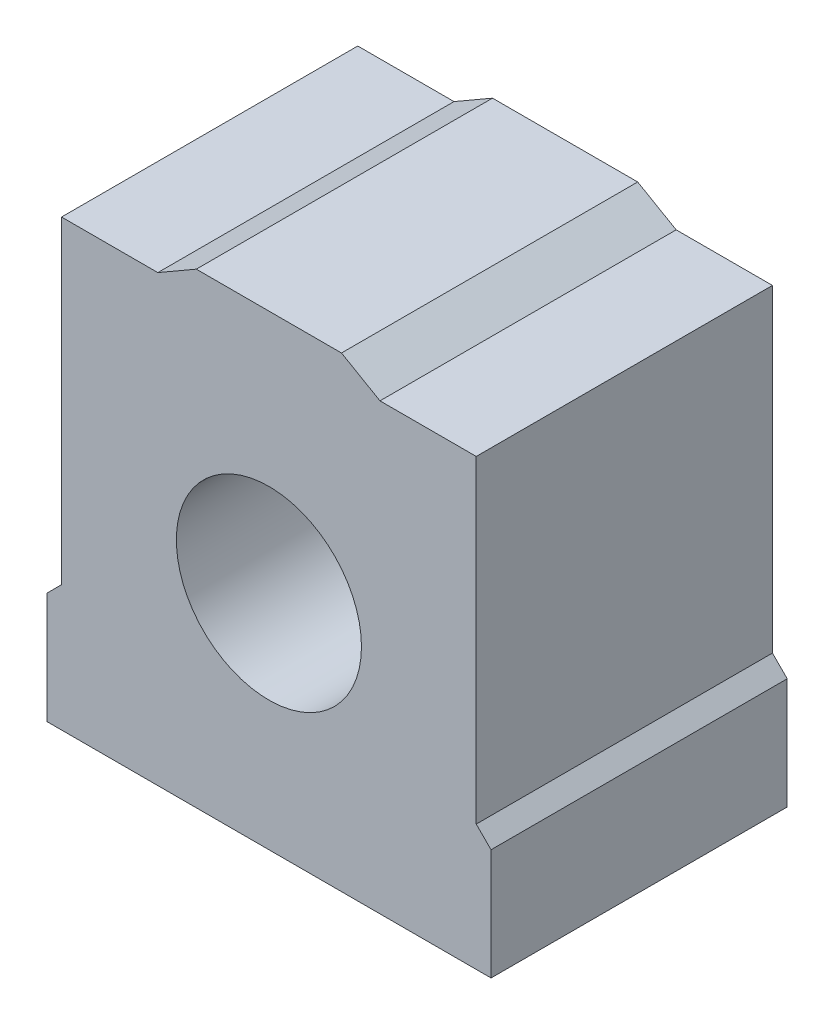
ISO-10303-21;
HEADER;
FILE_DESCRIPTION(('STEP AP214'),'2;1');
FILE_NAME('part.step','',(''),(''),'','','');
FILE_SCHEMA(('AUTOMOTIVE_DESIGN { 1 0 10303 214 1 1 1 1 }'));
ENDSEC;
DATA;
#1=APPLICATION_CONTEXT('core data for automotive mechanical design processes');
#2=APPLICATION_PROTOCOL_DEFINITION('international standard','automotive_design',2000,#1);
#3=PRODUCT_CONTEXT('',#1,'mechanical');
#4=PRODUCT('Part','Part','',(#3));
#5=PRODUCT_RELATED_PRODUCT_CATEGORY('part','',(#4));
#6=PRODUCT_DEFINITION_FORMATION('','',#4);
#7=PRODUCT_DEFINITION_CONTEXT('part definition',#1,'design');
#8=PRODUCT_DEFINITION('design','',#6,#7);
#9=PRODUCT_DEFINITION_SHAPE('','',#8);
#10=(LENGTH_UNIT() NAMED_UNIT(*) SI_UNIT(.MILLI.,.METRE.));
#11=(NAMED_UNIT(*) PLANE_ANGLE_UNIT() SI_UNIT($,.RADIAN.));
#12=(NAMED_UNIT(*) SI_UNIT($,.STERADIAN.) SOLID_ANGLE_UNIT());
#13=UNCERTAINTY_MEASURE_WITH_UNIT(LENGTH_MEASURE(1.E-05),#10,'distance_accuracy_value','');
#14=(GEOMETRIC_REPRESENTATION_CONTEXT(3) GLOBAL_UNCERTAINTY_ASSIGNED_CONTEXT((#13)) GLOBAL_UNIT_ASSIGNED_CONTEXT((#10,
#11,#12)) REPRESENTATION_CONTEXT('',''));
#15=CARTESIAN_POINT('',(0.,0.,0.));
#16=DIRECTION('',(0.,0.,1.));
#17=DIRECTION('',(1.,0.,0.));
#18=AXIS2_PLACEMENT_3D('',#15,#16,#17);
#19=CARTESIAN_POINT('',(0.,0.,20.));
#20=DIRECTION('',(0.,0.,-1.));
#21=DIRECTION('',(-1.,0.,0.));
#22=AXIS2_PLACEMENT_3D('',#19,#20,#21);
#23=PLANE('',#22);
#24=DIRECTION('',(0.,-1.,0.));
#25=VECTOR('',#24,1.);
#26=CARTESIAN_POINT('',(-30.,15.,20.));
#27=LINE('',#26,#25);
#28=CARTESIAN_POINT('',(-30.,15.,20.));
#29=VERTEX_POINT('',#28);
#30=CARTESIAN_POINT('',(-30.,0.,20.));
#31=VERTEX_POINT('',#30);
#32=EDGE_CURVE('E180',#29,#31,#27,.T.);
#33=ORIENTED_EDGE('',*,*,#32,.T.);
#34=DIRECTION('',(1.,0.,0.));
#35=VECTOR('',#34,1.);
#36=CARTESIAN_POINT('',(30.,0.,20.));
#37=LINE('',#36,#35);
#38=CARTESIAN_POINT('',(30.,0.,20.));
#39=VERTEX_POINT('',#38);
#40=EDGE_CURVE('E106',#31,#39,#37,.T.);
#41=ORIENTED_EDGE('',*,*,#40,.T.);
#42=DIRECTION('',(0.,1.,0.));
#43=VECTOR('',#42,1.);
#44=CARTESIAN_POINT('',(30.,15.,20.));
#45=LINE('',#44,#43);
#46=CARTESIAN_POINT('',(30.,15.,20.));
#47=VERTEX_POINT('',#46);
#48=EDGE_CURVE('E207',#39,#47,#45,.T.);
#49=ORIENTED_EDGE('',*,*,#48,.T.);
#50=DIRECTION('',(-0.707106781186544,0.707106781186551,0.));
#51=VECTOR('',#50,1.);
#52=CARTESIAN_POINT('',(28.,17.,20.));
#53=LINE('',#52,#51);
#54=CARTESIAN_POINT('',(28.,17.,20.));
#55=VERTEX_POINT('',#54);
#56=EDGE_CURVE('E226',#47,#55,#53,.T.);
#57=ORIENTED_EDGE('',*,*,#56,.T.);
#58=DIRECTION('',(0.,1.,0.));
#59=VECTOR('',#58,1.);
#60=CARTESIAN_POINT('',(28.,17.,20.));
#61=LINE('',#60,#59);
#62=CARTESIAN_POINT('',(28.,60.,20.));
#63=VERTEX_POINT('',#62);
#64=EDGE_CURVE('E223',#55,#63,#61,.T.);
#65=ORIENTED_EDGE('',*,*,#64,.T.);
#66=DIRECTION('',(-1.,0.,0.));
#67=VECTOR('',#66,1.);
#68=CARTESIAN_POINT('',(28.,60.,20.));
#69=LINE('',#68,#67);
#70=CARTESIAN_POINT('',(15.,60.,20.));
#71=VERTEX_POINT('',#70);
#72=EDGE_CURVE('E225',#63,#71,#69,.T.);
#73=ORIENTED_EDGE('',*,*,#72,.T.);
#74=DIRECTION('',(-0.866025403784442,0.499999999999995,0.));
#75=VECTOR('',#74,1.);
#76=CARTESIAN_POINT('',(15.,60.,20.));
#77=LINE('',#76,#75);
#78=CARTESIAN_POINT('',(9.80384757729329,63.,20.));
#79=VERTEX_POINT('',#78);
#80=EDGE_CURVE('E228',#71,#79,#77,.T.);
#81=ORIENTED_EDGE('',*,*,#80,.T.);
#82=DIRECTION('',(-1.,0.,0.));
#83=VECTOR('',#82,1.);
#84=CARTESIAN_POINT('',(-9.80384757729329,63.,20.));
#85=LINE('',#84,#83);
#86=CARTESIAN_POINT('',(-9.80384757729329,63.,20.));
#87=VERTEX_POINT('',#86);
#88=EDGE_CURVE('E234',#79,#87,#85,.T.);
#89=ORIENTED_EDGE('',*,*,#88,.T.);
#90=DIRECTION('',(-0.866025403784442,-0.499999999999995,0.));
#91=VECTOR('',#90,1.);
#92=CARTESIAN_POINT('',(-15.,60.,20.));
#93=LINE('',#92,#91);
#94=CARTESIAN_POINT('',(-15.,60.,20.));
#95=VERTEX_POINT('',#94);
#96=EDGE_CURVE('E139',#87,#95,#93,.T.);
#97=ORIENTED_EDGE('',*,*,#96,.T.);
#98=DIRECTION('',(-1.,0.,0.));
#99=VECTOR('',#98,1.);
#100=CARTESIAN_POINT('',(-15.,60.,20.));
#101=LINE('',#100,#99);
#102=CARTESIAN_POINT('',(-28.,60.,20.));
#103=VERTEX_POINT('',#102);
#104=EDGE_CURVE('E133',#95,#103,#101,.T.);
#105=ORIENTED_EDGE('',*,*,#104,.T.);
#106=DIRECTION('',(0.,-1.,0.));
#107=VECTOR('',#106,1.);
#108=CARTESIAN_POINT('',(-28.,17.,20.));
#109=LINE('',#108,#107);
#110=CARTESIAN_POINT('',(-28.,17.,20.));
#111=VERTEX_POINT('',#110);
#112=EDGE_CURVE('E137',#103,#111,#109,.T.);
#113=ORIENTED_EDGE('',*,*,#112,.T.);
#114=DIRECTION('',(-0.707106781186544,-0.707106781186551,0.));
#115=VECTOR('',#114,1.);
#116=CARTESIAN_POINT('',(-28.,17.,20.));
#117=LINE('',#116,#115);
#118=EDGE_CURVE('E50',#111,#29,#117,.T.);
#119=ORIENTED_EDGE('',*,*,#118,.T.);
#120=EDGE_LOOP('',(#33,#41,#49,#57,#65,#73,#81,#89,#97,#105,#113,#119));
#121=FACE_BOUND('',#120,.T.);
#122=CARTESIAN_POINT('',(0.,30.,20.));
#123=DIRECTION('',(0.,0.,1.));
#124=DIRECTION('',(1.,0.,0.));
#125=AXIS2_PLACEMENT_3D('',#122,#123,#124);
#126=CIRCLE('',#125,12.5);
#127=CARTESIAN_POINT('',(12.5,30.,20.));
#128=VERTEX_POINT('',#127);
#129=EDGE_CURVE('E161',#128,#128,#126,.T.);
#130=ORIENTED_EDGE('',*,*,#129,.F.);
#131=EDGE_LOOP('',(#130));
#132=FACE_BOUND('',#131,.T.);
#133=ADVANCED_FACE('F33',(#121,#132),#23,.F.);
#134=CARTESIAN_POINT('',(0.,0.,-20.));
#135=DIRECTION('',(0.,0.,-1.));
#136=DIRECTION('',(-1.,0.,0.));
#137=AXIS2_PLACEMENT_3D('',#134,#135,#136);
#138=PLANE('',#137);
#139=DIRECTION('',(0.,-1.,0.));
#140=VECTOR('',#139,1.);
#141=CARTESIAN_POINT('',(-30.,15.,-20.));
#142=LINE('',#141,#140);
#143=CARTESIAN_POINT('',(-30.,15.,-20.));
#144=VERTEX_POINT('',#143);
#145=CARTESIAN_POINT('',(-30.,0.,-20.));
#146=VERTEX_POINT('',#145);
#147=EDGE_CURVE('E157',#144,#146,#142,.T.);
#148=ORIENTED_EDGE('',*,*,#147,.F.);
#149=DIRECTION('',(-0.707106781186544,-0.707106781186551,0.));
#150=VECTOR('',#149,1.);
#151=CARTESIAN_POINT('',(-28.,17.,-20.));
#152=LINE('',#151,#150);
#153=CARTESIAN_POINT('',(-28.,17.,-20.));
#154=VERTEX_POINT('',#153);
#155=EDGE_CURVE('E98',#154,#144,#152,.T.);
#156=ORIENTED_EDGE('',*,*,#155,.F.);
#157=DIRECTION('',(0.,-1.,0.));
#158=VECTOR('',#157,1.);
#159=CARTESIAN_POINT('',(-28.,17.,-20.));
#160=LINE('',#159,#158);
#161=CARTESIAN_POINT('',(-28.,60.,-20.));
#162=VERTEX_POINT('',#161);
#163=EDGE_CURVE('E92',#162,#154,#160,.T.);
#164=ORIENTED_EDGE('',*,*,#163,.F.);
#165=DIRECTION('',(-1.,0.,0.));
#166=VECTOR('',#165,1.);
#167=CARTESIAN_POINT('',(-15.,60.,-20.));
#168=LINE('',#167,#166);
#169=CARTESIAN_POINT('',(-15.,60.,-20.));
#170=VERTEX_POINT('',#169);
#171=EDGE_CURVE('E147',#170,#162,#168,.T.);
#172=ORIENTED_EDGE('',*,*,#171,.F.);
#173=DIRECTION('',(-0.866025403784442,-0.499999999999995,0.));
#174=VECTOR('',#173,1.);
#175=CARTESIAN_POINT('',(-15.,60.,-20.));
#176=LINE('',#175,#174);
#177=CARTESIAN_POINT('',(-9.80384757729329,63.,-20.));
#178=VERTEX_POINT('',#177);
#179=EDGE_CURVE('E175',#178,#170,#176,.T.);
#180=ORIENTED_EDGE('',*,*,#179,.F.);
#181=DIRECTION('',(-1.,0.,0.));
#182=VECTOR('',#181,1.);
#183=CARTESIAN_POINT('',(-9.80384757729329,63.,-20.));
#184=LINE('',#183,#182);
#185=CARTESIAN_POINT('',(9.80384757729329,63.,-20.));
#186=VERTEX_POINT('',#185);
#187=EDGE_CURVE('E173',#186,#178,#184,.T.);
#188=ORIENTED_EDGE('',*,*,#187,.F.);
#189=DIRECTION('',(-0.866025403784442,0.499999999999995,0.));
#190=VECTOR('',#189,1.);
#191=CARTESIAN_POINT('',(15.,60.,-20.));
#192=LINE('',#191,#190);
#193=CARTESIAN_POINT('',(15.,60.,-20.));
#194=VERTEX_POINT('',#193);
#195=EDGE_CURVE('E171',#194,#186,#192,.T.);
#196=ORIENTED_EDGE('',*,*,#195,.F.);
#197=DIRECTION('',(-1.,0.,0.));
#198=VECTOR('',#197,1.);
#199=CARTESIAN_POINT('',(28.,60.,-20.));
#200=LINE('',#199,#198);
#201=CARTESIAN_POINT('',(28.,60.,-20.));
#202=VERTEX_POINT('',#201);
#203=EDGE_CURVE('E169',#202,#194,#200,.T.);
#204=ORIENTED_EDGE('',*,*,#203,.F.);
#205=DIRECTION('',(0.,1.,0.));
#206=VECTOR('',#205,1.);
#207=CARTESIAN_POINT('',(28.,17.,-20.));
#208=LINE('',#207,#206);
#209=CARTESIAN_POINT('',(28.,17.,-20.));
#210=VERTEX_POINT('',#209);
#211=EDGE_CURVE('E167',#210,#202,#208,.T.);
#212=ORIENTED_EDGE('',*,*,#211,.F.);
#213=DIRECTION('',(-0.707106781186544,0.707106781186551,0.));
#214=VECTOR('',#213,1.);
#215=CARTESIAN_POINT('',(28.,17.,-20.));
#216=LINE('',#215,#214);
#217=CARTESIAN_POINT('',(30.,15.,-20.));
#218=VERTEX_POINT('',#217);
#219=EDGE_CURVE('E165',#218,#210,#216,.T.);
#220=ORIENTED_EDGE('',*,*,#219,.F.);
#221=DIRECTION('',(0.,1.,0.));
#222=VECTOR('',#221,1.);
#223=CARTESIAN_POINT('',(30.,15.,-20.));
#224=LINE('',#223,#222);
#225=CARTESIAN_POINT('',(30.,0.,-20.));
#226=VERTEX_POINT('',#225);
#227=EDGE_CURVE('E163',#226,#218,#224,.T.);
#228=ORIENTED_EDGE('',*,*,#227,.F.);
#229=DIRECTION('',(1.,0.,0.));
#230=VECTOR('',#229,1.);
#231=CARTESIAN_POINT('',(30.,0.,-20.));
#232=LINE('',#231,#230);
#233=EDGE_CURVE('E160',#146,#226,#232,.T.);
#234=ORIENTED_EDGE('',*,*,#233,.F.);
#235=EDGE_LOOP('',(#148,#156,#164,#172,#180,#188,#196,#204,#212,#220,#228,#234));
#236=FACE_BOUND('',#235,.T.);
#237=CARTESIAN_POINT('',(0.,30.,-20.));
#238=DIRECTION('',(0.,0.,1.));
#239=DIRECTION('',(1.,0.,0.));
#240=AXIS2_PLACEMENT_3D('',#237,#238,#239);
#241=CIRCLE('',#240,12.5);
#242=CARTESIAN_POINT('',(12.5,30.,-20.));
#243=VERTEX_POINT('',#242);
#244=EDGE_CURVE('E328',#243,#243,#241,.T.);
#245=ORIENTED_EDGE('',*,*,#244,.T.);
#246=EDGE_LOOP('',(#245));
#247=FACE_BOUND('',#246,.T.);
#248=ADVANCED_FACE('F211',(#236,#247),#138,.T.);
#249=CARTESIAN_POINT('',(-30.,15.,20.));
#250=DIRECTION('',(1.,0.,0.));
#251=DIRECTION('',(0.,1.,0.));
#252=AXIS2_PLACEMENT_3D('',#249,#250,#251);
#253=PLANE('',#252);
#254=ORIENTED_EDGE('',*,*,#147,.T.);
#255=DIRECTION('',(0.,0.,-1.));
#256=VECTOR('',#255,1.);
#257=CARTESIAN_POINT('',(-30.,0.,20.));
#258=LINE('',#257,#256);
#259=EDGE_CURVE('E11',#31,#146,#258,.T.);
#260=ORIENTED_EDGE('',*,*,#259,.F.);
#261=ORIENTED_EDGE('',*,*,#32,.F.);
#262=DIRECTION('',(0.,0.,-1.));
#263=VECTOR('',#262,1.);
#264=CARTESIAN_POINT('',(-30.,15.,20.));
#265=LINE('',#264,#263);
#266=EDGE_CURVE('E153',#29,#144,#265,.T.);
#267=ORIENTED_EDGE('',*,*,#266,.T.);
#268=EDGE_LOOP('',(#254,#260,#261,#267));
#269=FACE_BOUND('',#268,.T.);
#270=ADVANCED_FACE('F35',(#269),#253,.F.);
#271=CARTESIAN_POINT('',(30.,0.,20.));
#272=DIRECTION('',(0.,1.,0.));
#273=DIRECTION('',(0.,0.,1.));
#274=AXIS2_PLACEMENT_3D('',#271,#272,#273);
#275=PLANE('',#274);
#276=CARTESIAN_POINT('',(-20.,0.,-10.));
#277=DIRECTION('',(0.,-1.,0.));
#278=DIRECTION('',(0.,0.,-1.));
#279=AXIS2_PLACEMENT_3D('',#276,#277,#278);
#280=CIRCLE('',#279,2.5527);
#281=CARTESIAN_POINT('',(-20.,0.,-12.5527));
#282=VERTEX_POINT('',#281);
#283=EDGE_CURVE('E305',#282,#282,#280,.T.);
#284=ORIENTED_EDGE('',*,*,#283,.F.);
#285=EDGE_LOOP('',(#284));
#286=FACE_BOUND('',#285,.T.);
#287=CARTESIAN_POINT('',(-20.,0.,10.));
#288=DIRECTION('',(0.,-1.,0.));
#289=DIRECTION('',(0.,0.,-1.));
#290=AXIS2_PLACEMENT_3D('',#287,#288,#289);
#291=CIRCLE('',#290,2.5527);
#292=CARTESIAN_POINT('',(-20.,0.,7.4473));
#293=VERTEX_POINT('',#292);
#294=EDGE_CURVE('E308',#293,#293,#291,.T.);
#295=ORIENTED_EDGE('',*,*,#294,.F.);
#296=EDGE_LOOP('',(#295));
#297=FACE_BOUND('',#296,.T.);
#298=CARTESIAN_POINT('',(20.,0.,9.99999999999999));
#299=DIRECTION('',(0.,-1.,0.));
#300=DIRECTION('',(0.,0.,-1.));
#301=AXIS2_PLACEMENT_3D('',#298,#299,#300);
#302=CIRCLE('',#301,2.5527);
#303=CARTESIAN_POINT('',(20.,0.,7.44729999999999));
#304=VERTEX_POINT('',#303);
#305=EDGE_CURVE('E316',#304,#304,#302,.T.);
#306=ORIENTED_EDGE('',*,*,#305,.F.);
#307=EDGE_LOOP('',(#306));
#308=FACE_BOUND('',#307,.T.);
#309=CARTESIAN_POINT('',(20.,0.,-9.99999999999999));
#310=DIRECTION('',(0.,-1.,0.));
#311=DIRECTION('',(0.,0.,-1.));
#312=AXIS2_PLACEMENT_3D('',#309,#310,#311);
#313=CIRCLE('',#312,2.5527);
#314=CARTESIAN_POINT('',(20.,0.,-12.5527));
#315=VERTEX_POINT('',#314);
#316=EDGE_CURVE('E322',#315,#315,#313,.T.);
#317=ORIENTED_EDGE('',*,*,#316,.F.);
#318=EDGE_LOOP('',(#317));
#319=FACE_BOUND('',#318,.T.);
#320=ORIENTED_EDGE('',*,*,#233,.T.);
#321=DIRECTION('',(0.,0.,-1.));
#322=VECTOR('',#321,1.);
#323=CARTESIAN_POINT('',(30.,0.,20.));
#324=LINE('',#323,#322);
#325=EDGE_CURVE('E42',#39,#226,#324,.T.);
#326=ORIENTED_EDGE('',*,*,#325,.F.);
#327=ORIENTED_EDGE('',*,*,#40,.F.);
#328=ORIENTED_EDGE('',*,*,#259,.T.);
#329=EDGE_LOOP('',(#320,#326,#327,#328));
#330=FACE_BOUND('',#329,.T.);
#331=ADVANCED_FACE('F342',(#286,#297,#308,#319,#330),#275,.F.);
#332=CARTESIAN_POINT('',(30.,15.,20.));
#333=DIRECTION('',(-1.,0.,0.));
#334=DIRECTION('',(0.,-1.,0.));
#335=AXIS2_PLACEMENT_3D('',#332,#333,#334);
#336=PLANE('',#335);
#337=ORIENTED_EDGE('',*,*,#227,.T.);
#338=DIRECTION('',(0.,0.,-1.));
#339=VECTOR('',#338,1.);
#340=CARTESIAN_POINT('',(30.,15.,20.));
#341=LINE('',#340,#339);
#342=EDGE_CURVE('E199',#47,#218,#341,.T.);
#343=ORIENTED_EDGE('',*,*,#342,.F.);
#344=ORIENTED_EDGE('',*,*,#48,.F.);
#345=ORIENTED_EDGE('',*,*,#325,.T.);
#346=EDGE_LOOP('',(#337,#343,#344,#345));
#347=FACE_BOUND('',#346,.T.);
#348=ADVANCED_FACE('F205',(#347),#336,.F.);
#349=CARTESIAN_POINT('',(28.,17.,20.));
#350=DIRECTION('',(-0.707106781186551,-0.707106781186544,0.));
#351=DIRECTION('',(0.707106781186544,-0.707106781186551,0.));
#352=AXIS2_PLACEMENT_3D('',#349,#350,#351);
#353=PLANE('',#352);
#354=ORIENTED_EDGE('',*,*,#219,.T.);
#355=DIRECTION('',(0.,0.,-1.));
#356=VECTOR('',#355,1.);
#357=CARTESIAN_POINT('',(28.,17.,20.));
#358=LINE('',#357,#356);
#359=EDGE_CURVE('E196',#55,#210,#358,.T.);
#360=ORIENTED_EDGE('',*,*,#359,.F.);
#361=ORIENTED_EDGE('',*,*,#56,.F.);
#362=ORIENTED_EDGE('',*,*,#342,.T.);
#363=EDGE_LOOP('',(#354,#360,#361,#362));
#364=FACE_BOUND('',#363,.T.);
#365=ADVANCED_FACE('F217',(#364),#353,.F.);
#366=CARTESIAN_POINT('',(28.,17.,20.));
#367=DIRECTION('',(-1.,0.,0.));
#368=DIRECTION('',(0.,0.,1.));
#369=AXIS2_PLACEMENT_3D('',#366,#367,#368);
#370=PLANE('',#369);
#371=ORIENTED_EDGE('',*,*,#211,.T.);
#372=DIRECTION('',(0.,0.,-1.));
#373=VECTOR('',#372,1.);
#374=CARTESIAN_POINT('',(28.,60.,20.));
#375=LINE('',#374,#373);
#376=EDGE_CURVE('E193',#63,#202,#375,.T.);
#377=ORIENTED_EDGE('',*,*,#376,.F.);
#378=ORIENTED_EDGE('',*,*,#64,.F.);
#379=ORIENTED_EDGE('',*,*,#359,.T.);
#380=EDGE_LOOP('',(#371,#377,#378,#379));
#381=FACE_BOUND('',#380,.T.);
#382=ADVANCED_FACE('F221',(#381),#370,.F.);
#383=CARTESIAN_POINT('',(28.,60.,20.));
#384=DIRECTION('',(0.,-1.,0.));
#385=DIRECTION('',(1.,0.,0.));
#386=AXIS2_PLACEMENT_3D('',#383,#384,#385);
#387=PLANE('',#386);
#388=ORIENTED_EDGE('',*,*,#203,.T.);
#389=DIRECTION('',(0.,0.,-1.));
#390=VECTOR('',#389,1.);
#391=CARTESIAN_POINT('',(15.,60.,20.));
#392=LINE('',#391,#390);
#393=EDGE_CURVE('E190',#71,#194,#392,.T.);
#394=ORIENTED_EDGE('',*,*,#393,.F.);
#395=ORIENTED_EDGE('',*,*,#72,.F.);
#396=ORIENTED_EDGE('',*,*,#376,.T.);
#397=EDGE_LOOP('',(#388,#394,#395,#396));
#398=FACE_BOUND('',#397,.T.);
#399=ADVANCED_FACE('F355',(#398),#387,.F.);
#400=CARTESIAN_POINT('',(15.,60.,20.));
#401=DIRECTION('',(-0.499999999999995,-0.866025403784442,0.));
#402=DIRECTION('',(0.866025403784442,-0.499999999999995,0.));
#403=AXIS2_PLACEMENT_3D('',#400,#401,#402);
#404=PLANE('',#403);
#405=ORIENTED_EDGE('',*,*,#195,.T.);
#406=DIRECTION('',(0.,0.,-1.));
#407=VECTOR('',#406,1.);
#408=CARTESIAN_POINT('',(9.80384757729329,63.,20.));
#409=LINE('',#408,#407);
#410=EDGE_CURVE('E187',#79,#186,#409,.T.);
#411=ORIENTED_EDGE('',*,*,#410,.F.);
#412=ORIENTED_EDGE('',*,*,#80,.F.);
#413=ORIENTED_EDGE('',*,*,#393,.T.);
#414=EDGE_LOOP('',(#405,#411,#412,#413));
#415=FACE_BOUND('',#414,.T.);
#416=ADVANCED_FACE('F358',(#415),#404,.F.);
#417=CARTESIAN_POINT('',(-9.80384757729329,63.,20.));
#418=DIRECTION('',(0.,-1.,0.));
#419=DIRECTION('',(0.,0.,-1.));
#420=AXIS2_PLACEMENT_3D('',#417,#418,#419);
#421=PLANE('',#420);
#422=ORIENTED_EDGE('',*,*,#187,.T.);
#423=DIRECTION('',(0.,0.,-1.));
#424=VECTOR('',#423,1.);
#425=CARTESIAN_POINT('',(-9.80384757729329,63.,20.));
#426=LINE('',#425,#424);
#427=EDGE_CURVE('E184',#87,#178,#426,.T.);
#428=ORIENTED_EDGE('',*,*,#427,.F.);
#429=ORIENTED_EDGE('',*,*,#88,.F.);
#430=ORIENTED_EDGE('',*,*,#410,.T.);
#431=EDGE_LOOP('',(#422,#428,#429,#430));
#432=FACE_BOUND('',#431,.T.);
#433=ADVANCED_FACE('F240',(#432),#421,.F.);
#434=CARTESIAN_POINT('',(-15.,60.,20.));
#435=DIRECTION('',(0.499999999999995,-0.866025403784442,0.));
#436=DIRECTION('',(0.866025403784442,0.499999999999995,0.));
#437=AXIS2_PLACEMENT_3D('',#434,#435,#436);
#438=PLANE('',#437);
#439=ORIENTED_EDGE('',*,*,#179,.T.);
#440=DIRECTION('',(0.,0.,-1.));
#441=VECTOR('',#440,1.);
#442=CARTESIAN_POINT('',(-15.,60.,20.));
#443=LINE('',#442,#441);
#444=EDGE_CURVE('E148',#95,#170,#443,.T.);
#445=ORIENTED_EDGE('',*,*,#444,.F.);
#446=ORIENTED_EDGE('',*,*,#96,.F.);
#447=ORIENTED_EDGE('',*,*,#427,.T.);
#448=EDGE_LOOP('',(#439,#445,#446,#447));
#449=FACE_BOUND('',#448,.T.);
#450=ADVANCED_FACE('F244',(#449),#438,.F.);
#451=CARTESIAN_POINT('',(-15.,60.,20.));
#452=DIRECTION('',(0.,-1.,0.));
#453=DIRECTION('',(1.,0.,0.));
#454=AXIS2_PLACEMENT_3D('',#451,#452,#453);
#455=PLANE('',#454);
#456=ORIENTED_EDGE('',*,*,#171,.T.);
#457=DIRECTION('',(0.,0.,-1.));
#458=VECTOR('',#457,1.);
#459=CARTESIAN_POINT('',(-28.,60.,20.));
#460=LINE('',#459,#458);
#461=EDGE_CURVE('E144',#103,#162,#460,.T.);
#462=ORIENTED_EDGE('',*,*,#461,.F.);
#463=ORIENTED_EDGE('',*,*,#104,.F.);
#464=ORIENTED_EDGE('',*,*,#444,.T.);
#465=EDGE_LOOP('',(#456,#462,#463,#464));
#466=FACE_BOUND('',#465,.T.);
#467=ADVANCED_FACE('F145',(#466),#455,.F.);
#468=CARTESIAN_POINT('',(-28.,17.,20.));
#469=DIRECTION('',(1.,0.,0.));
#470=DIRECTION('',(0.,0.,-1.));
#471=AXIS2_PLACEMENT_3D('',#468,#469,#470);
#472=PLANE('',#471);
#473=ORIENTED_EDGE('',*,*,#163,.T.);
#474=DIRECTION('',(0.,0.,-1.));
#475=VECTOR('',#474,1.);
#476=CARTESIAN_POINT('',(-28.,17.,20.));
#477=LINE('',#476,#475);
#478=EDGE_CURVE('E149',#111,#154,#477,.T.);
#479=ORIENTED_EDGE('',*,*,#478,.F.);
#480=ORIENTED_EDGE('',*,*,#112,.F.);
#481=ORIENTED_EDGE('',*,*,#461,.T.);
#482=EDGE_LOOP('',(#473,#479,#480,#481));
#483=FACE_BOUND('',#482,.T.);
#484=ADVANCED_FACE('F151',(#483),#472,.F.);
#485=CARTESIAN_POINT('',(-28.,17.,20.));
#486=DIRECTION('',(0.707106781186551,-0.707106781186544,0.));
#487=DIRECTION('',(0.707106781186544,0.707106781186551,0.));
#488=AXIS2_PLACEMENT_3D('',#485,#486,#487);
#489=PLANE('',#488);
#490=ORIENTED_EDGE('',*,*,#155,.T.);
#491=ORIENTED_EDGE('',*,*,#266,.F.);
#492=ORIENTED_EDGE('',*,*,#118,.F.);
#493=ORIENTED_EDGE('',*,*,#478,.T.);
#494=EDGE_LOOP('',(#490,#491,#492,#493));
#495=FACE_BOUND('',#494,.T.);
#496=ADVANCED_FACE('F248',(#495),#489,.F.);
#497=CARTESIAN_POINT('',(0.,30.,20.));
#498=DIRECTION('',(0.,0.,-1.));
#499=DIRECTION('',(-1.,0.,0.));
#500=AXIS2_PLACEMENT_3D('',#497,#498,#499);
#501=CYLINDRICAL_SURFACE('',#500,12.5);
#502=ORIENTED_EDGE('',*,*,#129,.T.);
#503=EDGE_LOOP('',(#502));
#504=FACE_BOUND('',#503,.T.);
#505=ORIENTED_EDGE('',*,*,#244,.F.);
#506=EDGE_LOOP('',(#505));
#507=FACE_BOUND('',#506,.T.);
#508=ADVANCED_FACE('F250',(#504,#507),#501,.F.);
#509=CARTESIAN_POINT('',(20.,19.05,-9.99999999999999));
#510=DIRECTION('',(0.,-1.,0.));
#511=DIRECTION('',(0.,0.,-1.));
#512=AXIS2_PLACEMENT_3D('',#509,#510,#511);
#513=CONICAL_SURFACE('',#512,2.5527,1.02974425867665);
#514=CARTESIAN_POINT('',(20.,20.5838169021917,-9.99999999999999));
#515=VERTEX_POINT('',#514);
#516=VERTEX_LOOP('',#515);
#517=FACE_BOUND('',#516,.T.);
#518=CARTESIAN_POINT('',(20.,19.05,-9.99999999999999));
#519=DIRECTION('',(0.,-1.,0.));
#520=DIRECTION('',(0.,0.,-1.));
#521=AXIS2_PLACEMENT_3D('',#518,#519,#520);
#522=CIRCLE('',#521,2.5527);
#523=CARTESIAN_POINT('',(20.,19.05,-12.5527));
#524=VERTEX_POINT('',#523);
#525=EDGE_CURVE('E325',#524,#524,#522,.T.);
#526=ORIENTED_EDGE('',*,*,#525,.T.);
#527=EDGE_LOOP('',(#526));
#528=FACE_BOUND('',#527,.T.);
#529=ADVANCED_FACE('F256',(#517,#528),#513,.F.);
#530=CARTESIAN_POINT('',(20.,0.,-9.99999999999999));
#531=DIRECTION('',(0.,-1.,0.));
#532=DIRECTION('',(0.,0.,-1.));
#533=AXIS2_PLACEMENT_3D('',#530,#531,#532);
#534=CYLINDRICAL_SURFACE('',#533,2.5527);
#535=ORIENTED_EDGE('',*,*,#525,.F.);
#536=EDGE_LOOP('',(#535));
#537=FACE_BOUND('',#536,.T.);
#538=ORIENTED_EDGE('',*,*,#316,.T.);
#539=EDGE_LOOP('',(#538));
#540=FACE_BOUND('',#539,.T.);
#541=ADVANCED_FACE('F269',(#537,#540),#534,.F.);
#542=CARTESIAN_POINT('',(20.,19.05,9.99999999999999));
#543=DIRECTION('',(0.,-1.,0.));
#544=DIRECTION('',(0.,0.,-1.));
#545=AXIS2_PLACEMENT_3D('',#542,#543,#544);
#546=CONICAL_SURFACE('',#545,2.5527,1.02974425867665);
#547=CARTESIAN_POINT('',(20.,20.5838169021917,9.99999999999999));
#548=VERTEX_POINT('',#547);
#549=VERTEX_LOOP('',#548);
#550=FACE_BOUND('',#549,.T.);
#551=CARTESIAN_POINT('',(20.,19.05,9.99999999999999));
#552=DIRECTION('',(0.,-1.,0.));
#553=DIRECTION('',(0.,0.,-1.));
#554=AXIS2_PLACEMENT_3D('',#551,#552,#553);
#555=CIRCLE('',#554,2.5527);
#556=CARTESIAN_POINT('',(20.,19.05,7.44729999999999));
#557=VERTEX_POINT('',#556);
#558=EDGE_CURVE('E319',#557,#557,#555,.T.);
#559=ORIENTED_EDGE('',*,*,#558,.T.);
#560=EDGE_LOOP('',(#559));
#561=FACE_BOUND('',#560,.T.);
#562=ADVANCED_FACE('F273',(#550,#561),#546,.F.);
#563=CARTESIAN_POINT('',(20.,0.,9.99999999999999));
#564=DIRECTION('',(0.,-1.,0.));
#565=DIRECTION('',(0.,0.,-1.));
#566=AXIS2_PLACEMENT_3D('',#563,#564,#565);
#567=CYLINDRICAL_SURFACE('',#566,2.5527);
#568=ORIENTED_EDGE('',*,*,#558,.F.);
#569=EDGE_LOOP('',(#568));
#570=FACE_BOUND('',#569,.T.);
#571=ORIENTED_EDGE('',*,*,#305,.T.);
#572=EDGE_LOOP('',(#571));
#573=FACE_BOUND('',#572,.T.);
#574=ADVANCED_FACE('F277',(#570,#573),#567,.F.);
#575=CARTESIAN_POINT('',(-20.,19.05,10.));
#576=DIRECTION('',(0.,-1.,0.));
#577=DIRECTION('',(0.,0.,-1.));
#578=AXIS2_PLACEMENT_3D('',#575,#576,#577);
#579=CONICAL_SURFACE('',#578,2.5527,1.02974425867665);
#580=CARTESIAN_POINT('',(-20.,20.5838169021917,10.));
#581=VERTEX_POINT('',#580);
#582=VERTEX_LOOP('',#581);
#583=FACE_BOUND('',#582,.T.);
#584=CARTESIAN_POINT('',(-20.,19.05,10.));
#585=DIRECTION('',(0.,-1.,0.));
#586=DIRECTION('',(0.,0.,-1.));
#587=AXIS2_PLACEMENT_3D('',#584,#585,#586);
#588=CIRCLE('',#587,2.5527);
#589=CARTESIAN_POINT('',(-20.,19.05,7.4473));
#590=VERTEX_POINT('',#589);
#591=EDGE_CURVE('E313',#590,#590,#588,.T.);
#592=ORIENTED_EDGE('',*,*,#591,.T.);
#593=EDGE_LOOP('',(#592));
#594=FACE_BOUND('',#593,.T.);
#595=ADVANCED_FACE('F281',(#583,#594),#579,.F.);
#596=CARTESIAN_POINT('',(-20.,0.,10.));
#597=DIRECTION('',(0.,-1.,0.));
#598=DIRECTION('',(0.,0.,-1.));
#599=AXIS2_PLACEMENT_3D('',#596,#597,#598);
#600=CYLINDRICAL_SURFACE('',#599,2.5527);
#601=ORIENTED_EDGE('',*,*,#591,.F.);
#602=EDGE_LOOP('',(#601));
#603=FACE_BOUND('',#602,.T.);
#604=ORIENTED_EDGE('',*,*,#294,.T.);
#605=EDGE_LOOP('',(#604));
#606=FACE_BOUND('',#605,.T.);
#607=ADVANCED_FACE('F285',(#603,#606),#600,.F.);
#608=CARTESIAN_POINT('',(-20.,19.05,-10.));
#609=DIRECTION('',(0.,-1.,0.));
#610=DIRECTION('',(0.,0.,-1.));
#611=AXIS2_PLACEMENT_3D('',#608,#609,#610);
#612=CONICAL_SURFACE('',#611,2.5527,1.02974425867665);
#613=CARTESIAN_POINT('',(-20.,20.5838169021917,-10.));
#614=VERTEX_POINT('',#613);
#615=VERTEX_LOOP('',#614);
#616=FACE_BOUND('',#615,.T.);
#617=CARTESIAN_POINT('',(-20.,19.05,-10.));
#618=DIRECTION('',(0.,-1.,0.));
#619=DIRECTION('',(0.,0.,-1.));
#620=AXIS2_PLACEMENT_3D('',#617,#618,#619);
#621=CIRCLE('',#620,2.5527);
#622=CARTESIAN_POINT('',(-20.,19.05,-12.5527));
#623=VERTEX_POINT('',#622);
#624=EDGE_CURVE('E302',#623,#623,#621,.T.);
#625=ORIENTED_EDGE('',*,*,#624,.T.);
#626=EDGE_LOOP('',(#625));
#627=FACE_BOUND('',#626,.T.);
#628=ADVANCED_FACE('F289',(#616,#627),#612,.F.);
#629=CARTESIAN_POINT('',(-20.,0.,-10.));
#630=DIRECTION('',(0.,-1.,0.));
#631=DIRECTION('',(0.,0.,-1.));
#632=AXIS2_PLACEMENT_3D('',#629,#630,#631);
#633=CYLINDRICAL_SURFACE('',#632,2.5527);
#634=ORIENTED_EDGE('',*,*,#624,.F.);
#635=EDGE_LOOP('',(#634));
#636=FACE_BOUND('',#635,.T.);
#637=ORIENTED_EDGE('',*,*,#283,.T.);
#638=EDGE_LOOP('',(#637));
#639=FACE_BOUND('',#638,.T.);
#640=ADVANCED_FACE('F293',(#636,#639),#633,.F.);
#641=CLOSED_SHELL('',(#133,#248,#270,#331,#348,#365,#382,#399,#416,#433,#450,#467,#484,#496,
#508,#529,#541,#562,#574,#595,#607,#628,#640));
#642=MANIFOLD_SOLID_BREP('B2',#641);
#643=ADVANCED_BREP_SHAPE_REPRESENTATION('',(#18,#642),#14);
#644=SHAPE_DEFINITION_REPRESENTATION(#9,#643);
ENDSEC;
END-ISO-10303-21;
